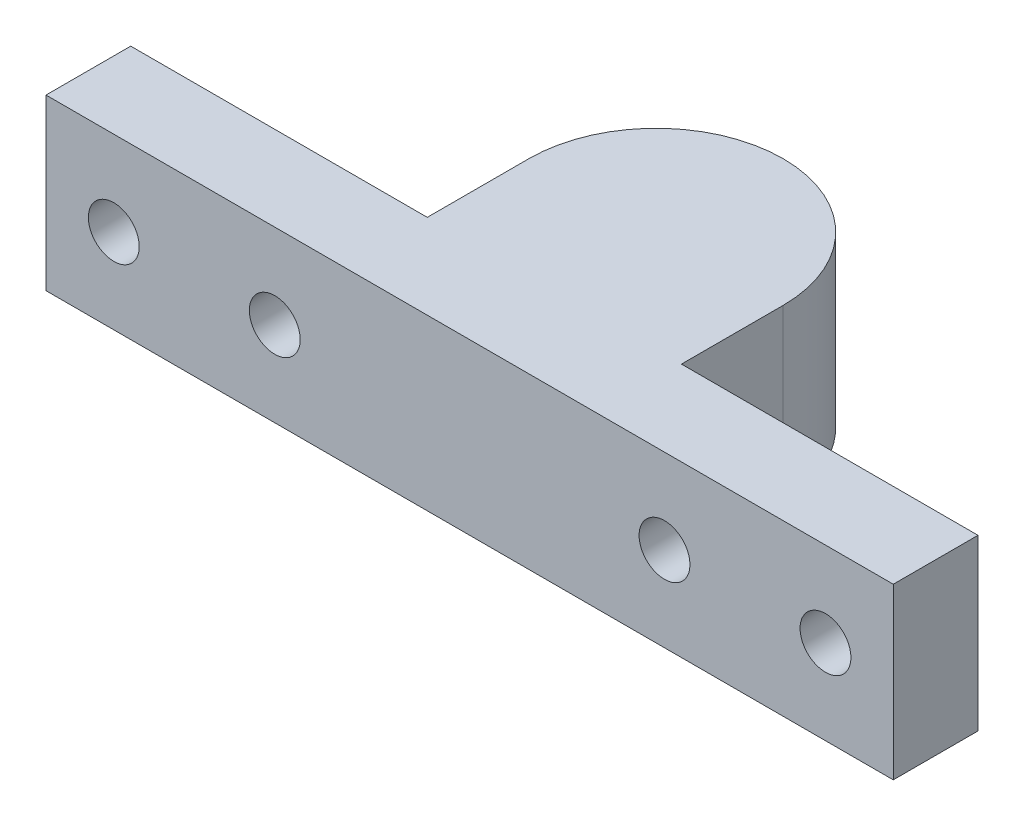
ISO-10303-21;
HEADER;
FILE_DESCRIPTION(('STEP AP214'),'2;1');
FILE_NAME('part.step','',(''),(''),'','','');
FILE_SCHEMA(('AUTOMOTIVE_DESIGN { 1 0 10303 214 1 1 1 1 }'));
ENDSEC;
DATA;
#1=APPLICATION_CONTEXT('core data for automotive mechanical design processes');
#2=APPLICATION_PROTOCOL_DEFINITION('international standard','automotive_design',2000,#1);
#3=PRODUCT_CONTEXT('',#1,'mechanical');
#4=PRODUCT('Part','Part','',(#3));
#5=PRODUCT_RELATED_PRODUCT_CATEGORY('part','',(#4));
#6=PRODUCT_DEFINITION_FORMATION('','',#4);
#7=PRODUCT_DEFINITION_CONTEXT('part definition',#1,'design');
#8=PRODUCT_DEFINITION('design','',#6,#7);
#9=PRODUCT_DEFINITION_SHAPE('','',#8);
#10=(LENGTH_UNIT() NAMED_UNIT(*) SI_UNIT(.MILLI.,.METRE.));
#11=(NAMED_UNIT(*) PLANE_ANGLE_UNIT() SI_UNIT($,.RADIAN.));
#12=(NAMED_UNIT(*) SI_UNIT($,.STERADIAN.) SOLID_ANGLE_UNIT());
#13=UNCERTAINTY_MEASURE_WITH_UNIT(LENGTH_MEASURE(1.E-05),#10,'distance_accuracy_value','');
#14=(GEOMETRIC_REPRESENTATION_CONTEXT(3) GLOBAL_UNCERTAINTY_ASSIGNED_CONTEXT((#13)) GLOBAL_UNIT_ASSIGNED_CONTEXT((#10,
#11,#12)) REPRESENTATION_CONTEXT('',''));
#15=CARTESIAN_POINT('',(0.,0.,0.));
#16=DIRECTION('',(0.,0.,1.));
#17=DIRECTION('',(1.,0.,0.));
#18=AXIS2_PLACEMENT_3D('',#15,#16,#17);
#19=CARTESIAN_POINT('',(-25.,10.,0.));
#20=DIRECTION('',(0.,0.,-1.));
#21=DIRECTION('',(-1.,0.,0.));
#22=AXIS2_PLACEMENT_3D('',#19,#20,#21);
#23=PLANE('',#22);
#24=CARTESIAN_POINT('',(21.,5.,0.));
#25=DIRECTION('',(0.,0.,-1.));
#26=DIRECTION('',(-1.,0.,0.));
#27=AXIS2_PLACEMENT_3D('',#24,#25,#26);
#28=CIRCLE('',#27,1.5);
#29=CARTESIAN_POINT('',(19.5,5.,0.));
#30=VERTEX_POINT('',#29);
#31=EDGE_CURVE('E167',#30,#30,#28,.T.);
#32=ORIENTED_EDGE('',*,*,#31,.T.);
#33=EDGE_LOOP('',(#32));
#34=FACE_BOUND('',#33,.T.);
#35=CARTESIAN_POINT('',(11.5,5.,0.));
#36=DIRECTION('',(0.,0.,-1.));
#37=DIRECTION('',(-1.,0.,0.));
#38=AXIS2_PLACEMENT_3D('',#35,#36,#37);
#39=CIRCLE('',#38,1.5);
#40=CARTESIAN_POINT('',(10.,5.,0.));
#41=VERTEX_POINT('',#40);
#42=EDGE_CURVE('E244',#41,#41,#39,.T.);
#43=ORIENTED_EDGE('',*,*,#42,.T.);
#44=EDGE_LOOP('',(#43));
#45=FACE_BOUND('',#44,.T.);
#46=CARTESIAN_POINT('',(-11.5,5.,0.));
#47=DIRECTION('',(0.,0.,-1.));
#48=DIRECTION('',(-1.,0.,0.));
#49=AXIS2_PLACEMENT_3D('',#46,#47,#48);
#50=CIRCLE('',#49,1.5);
#51=CARTESIAN_POINT('',(-13.,5.,0.));
#52=VERTEX_POINT('',#51);
#53=EDGE_CURVE('E236',#52,#52,#50,.T.);
#54=ORIENTED_EDGE('',*,*,#53,.T.);
#55=EDGE_LOOP('',(#54));
#56=FACE_BOUND('',#55,.T.);
#57=CARTESIAN_POINT('',(-21.,5.,0.));
#58=DIRECTION('',(0.,0.,-1.));
#59=DIRECTION('',(-1.,0.,0.));
#60=AXIS2_PLACEMENT_3D('',#57,#58,#59);
#61=CIRCLE('',#60,1.5);
#62=CARTESIAN_POINT('',(-22.5,5.,0.));
#63=VERTEX_POINT('',#62);
#64=EDGE_CURVE('E227',#63,#63,#61,.T.);
#65=ORIENTED_EDGE('',*,*,#64,.T.);
#66=EDGE_LOOP('',(#65));
#67=FACE_BOUND('',#66,.T.);
#68=DIRECTION('',(1.,0.,0.));
#69=VECTOR('',#68,1.);
#70=CARTESIAN_POINT('',(-25.,0.,0.));
#71=LINE('',#70,#69);
#72=CARTESIAN_POINT('',(-25.,0.,0.));
#73=VERTEX_POINT('',#72);
#74=CARTESIAN_POINT('',(25.,0.,0.));
#75=VERTEX_POINT('',#74);
#76=EDGE_CURVE('E163',#73,#75,#71,.T.);
#77=ORIENTED_EDGE('',*,*,#76,.T.);
#78=DIRECTION('',(0.,-1.,0.));
#79=VECTOR('',#78,1.);
#80=CARTESIAN_POINT('',(25.,10.,0.));
#81=LINE('',#80,#79);
#82=CARTESIAN_POINT('',(25.,10.,0.));
#83=VERTEX_POINT('',#82);
#84=EDGE_CURVE('E11',#83,#75,#81,.T.);
#85=ORIENTED_EDGE('',*,*,#84,.F.);
#86=DIRECTION('',(1.,0.,0.));
#87=VECTOR('',#86,1.);
#88=CARTESIAN_POINT('',(-25.,10.,0.));
#89=LINE('',#88,#87);
#90=CARTESIAN_POINT('',(-25.,10.,0.));
#91=VERTEX_POINT('',#90);
#92=EDGE_CURVE('E190',#91,#83,#89,.T.);
#93=ORIENTED_EDGE('',*,*,#92,.F.);
#94=DIRECTION('',(0.,-1.,0.));
#95=VECTOR('',#94,1.);
#96=CARTESIAN_POINT('',(-25.,10.,0.));
#97=LINE('',#96,#95);
#98=EDGE_CURVE('E70',#91,#73,#97,.T.);
#99=ORIENTED_EDGE('',*,*,#98,.T.);
#100=EDGE_LOOP('',(#77,#85,#93,#99));
#101=FACE_BOUND('',#100,.T.);
#102=ADVANCED_FACE('F46',(#34,#45,#56,#67,#101),#23,.F.);
#103=CARTESIAN_POINT('',(25.,10.,0.));
#104=DIRECTION('',(-1.,0.,0.));
#105=DIRECTION('',(0.,0.,1.));
#106=AXIS2_PLACEMENT_3D('',#103,#104,#105);
#107=PLANE('',#106);
#108=DIRECTION('',(0.,0.,-1.));
#109=VECTOR('',#108,1.);
#110=CARTESIAN_POINT('',(25.,0.,0.));
#111=LINE('',#110,#109);
#112=CARTESIAN_POINT('',(25.,0.,-5.00000000000001));
#113=VERTEX_POINT('',#112);
#114=EDGE_CURVE('E166',#75,#113,#111,.T.);
#115=ORIENTED_EDGE('',*,*,#114,.T.);
#116=DIRECTION('',(0.,-1.,0.));
#117=VECTOR('',#116,1.);
#118=CARTESIAN_POINT('',(25.,10.,-5.00000000000001));
#119=LINE('',#118,#117);
#120=CARTESIAN_POINT('',(25.,10.,-5.00000000000001));
#121=VERTEX_POINT('',#120);
#122=EDGE_CURVE('E54',#121,#113,#119,.T.);
#123=ORIENTED_EDGE('',*,*,#122,.F.);
#124=DIRECTION('',(0.,0.,-1.));
#125=VECTOR('',#124,1.);
#126=CARTESIAN_POINT('',(25.,10.,0.));
#127=LINE('',#126,#125);
#128=EDGE_CURVE('E109',#83,#121,#127,.T.);
#129=ORIENTED_EDGE('',*,*,#128,.F.);
#130=ORIENTED_EDGE('',*,*,#84,.T.);
#131=EDGE_LOOP('',(#115,#123,#129,#130));
#132=FACE_BOUND('',#131,.T.);
#133=ADVANCED_FACE('F341',(#132),#107,.F.);
#134=CARTESIAN_POINT('',(25.,10.,-5.00000000000001));
#135=DIRECTION('',(0.,0.,1.));
#136=DIRECTION('',(1.,0.,0.));
#137=AXIS2_PLACEMENT_3D('',#134,#135,#136);
#138=PLANE('',#137);
#139=CARTESIAN_POINT('',(21.,5.,-5.00000000000001));
#140=DIRECTION('',(0.,0.,-1.));
#141=DIRECTION('',(-1.,0.,0.));
#142=AXIS2_PLACEMENT_3D('',#139,#140,#141);
#143=CIRCLE('',#142,1.5);
#144=CARTESIAN_POINT('',(19.5,5.,-5.00000000000001));
#145=VERTEX_POINT('',#144);
#146=EDGE_CURVE('E252',#145,#145,#143,.T.);
#147=ORIENTED_EDGE('',*,*,#146,.F.);
#148=EDGE_LOOP('',(#147));
#149=FACE_BOUND('',#148,.T.);
#150=CARTESIAN_POINT('',(11.5,5.,-5.00000000000001));
#151=DIRECTION('',(0.,0.,-1.));
#152=DIRECTION('',(-1.,0.,0.));
#153=AXIS2_PLACEMENT_3D('',#150,#151,#152);
#154=CIRCLE('',#153,1.5);
#155=CARTESIAN_POINT('',(10.,5.,-5.00000000000001));
#156=VERTEX_POINT('',#155);
#157=EDGE_CURVE('E248',#156,#156,#154,.T.);
#158=ORIENTED_EDGE('',*,*,#157,.F.);
#159=EDGE_LOOP('',(#158));
#160=FACE_BOUND('',#159,.T.);
#161=DIRECTION('',(-1.,0.,0.));
#162=VECTOR('',#161,1.);
#163=CARTESIAN_POINT('',(25.,0.,-5.00000000000001));
#164=LINE('',#163,#162);
#165=CARTESIAN_POINT('',(7.5,0.,-5.00000000000001));
#166=VERTEX_POINT('',#165);
#167=EDGE_CURVE('E170',#113,#166,#164,.T.);
#168=ORIENTED_EDGE('',*,*,#167,.T.);
#169=DIRECTION('',(0.,-1.,0.));
#170=VECTOR('',#169,1.);
#171=CARTESIAN_POINT('',(7.5,10.,-5.00000000000001));
#172=LINE('',#171,#170);
#173=CARTESIAN_POINT('',(7.5,10.,-5.00000000000001));
#174=VERTEX_POINT('',#173);
#175=EDGE_CURVE('E200',#174,#166,#172,.T.);
#176=ORIENTED_EDGE('',*,*,#175,.F.);
#177=DIRECTION('',(-1.,0.,0.));
#178=VECTOR('',#177,1.);
#179=CARTESIAN_POINT('',(25.,10.,-5.00000000000001));
#180=LINE('',#179,#178);
#181=EDGE_CURVE('E210',#121,#174,#180,.T.);
#182=ORIENTED_EDGE('',*,*,#181,.F.);
#183=ORIENTED_EDGE('',*,*,#122,.T.);
#184=EDGE_LOOP('',(#168,#176,#182,#183));
#185=FACE_BOUND('',#184,.T.);
#186=ADVANCED_FACE('F208',(#149,#160,#185),#138,.F.);
#187=CARTESIAN_POINT('',(7.5,10.,-5.00000000000001));
#188=DIRECTION('',(-1.,0.,0.));
#189=DIRECTION('',(0.,0.,1.));
#190=AXIS2_PLACEMENT_3D('',#187,#188,#189);
#191=PLANE('',#190);
#192=DIRECTION('',(0.,0.,-1.));
#193=VECTOR('',#192,1.);
#194=CARTESIAN_POINT('',(7.5,0.,-5.00000000000001));
#195=LINE('',#194,#193);
#196=CARTESIAN_POINT('',(7.5,0.,-11.));
#197=VERTEX_POINT('',#196);
#198=EDGE_CURVE('E173',#166,#197,#195,.T.);
#199=ORIENTED_EDGE('',*,*,#198,.T.);
#200=DIRECTION('',(0.,-1.,0.));
#201=VECTOR('',#200,1.);
#202=CARTESIAN_POINT('',(7.5,10.,-11.));
#203=LINE('',#202,#201);
#204=CARTESIAN_POINT('',(7.5,10.,-11.));
#205=VERTEX_POINT('',#204);
#206=EDGE_CURVE('E197',#205,#197,#203,.T.);
#207=ORIENTED_EDGE('',*,*,#206,.F.);
#208=DIRECTION('',(0.,0.,-1.));
#209=VECTOR('',#208,1.);
#210=CARTESIAN_POINT('',(7.5,10.,-5.00000000000001));
#211=LINE('',#210,#209);
#212=EDGE_CURVE('E157',#174,#205,#211,.T.);
#213=ORIENTED_EDGE('',*,*,#212,.F.);
#214=ORIENTED_EDGE('',*,*,#175,.T.);
#215=EDGE_LOOP('',(#199,#207,#213,#214));
#216=FACE_BOUND('',#215,.T.);
#217=ADVANCED_FACE('F217',(#216),#191,.F.);
#218=CARTESIAN_POINT('',(0.,10.,-11.));
#219=DIRECTION('',(0.,-1.,0.));
#220=DIRECTION('',(0.,0.,-1.));
#221=AXIS2_PLACEMENT_3D('',#218,#219,#220);
#222=CYLINDRICAL_SURFACE('',#221,7.5);
#223=CARTESIAN_POINT('',(0.,0.,-11.));
#224=DIRECTION('',(0.,-1.,0.));
#225=DIRECTION('',(0.,0.,-1.));
#226=AXIS2_PLACEMENT_3D('',#223,#224,#225);
#227=CIRCLE('',#226,7.5);
#228=CARTESIAN_POINT('',(-7.5,0.,-11.));
#229=VERTEX_POINT('',#228);
#230=EDGE_CURVE('E177',#229,#197,#227,.T.);
#231=ORIENTED_EDGE('',*,*,#230,.F.);
#232=DIRECTION('',(0.,-1.,0.));
#233=VECTOR('',#232,1.);
#234=CARTESIAN_POINT('',(-7.5,10.,-11.));
#235=LINE('',#234,#233);
#236=CARTESIAN_POINT('',(-7.5,10.,-11.));
#237=VERTEX_POINT('',#236);
#238=EDGE_CURVE('E139',#237,#229,#235,.T.);
#239=ORIENTED_EDGE('',*,*,#238,.F.);
#240=CARTESIAN_POINT('',(0.,10.,-11.));
#241=DIRECTION('',(0.,-1.,0.));
#242=DIRECTION('',(0.,0.,-1.));
#243=AXIS2_PLACEMENT_3D('',#240,#241,#242);
#244=CIRCLE('',#243,7.5);
#245=EDGE_CURVE('E153',#237,#205,#244,.T.);
#246=ORIENTED_EDGE('',*,*,#245,.T.);
#247=ORIENTED_EDGE('',*,*,#206,.T.);
#248=EDGE_LOOP('',(#231,#239,#246,#247));
#249=FACE_BOUND('',#248,.T.);
#250=ADVANCED_FACE('F369',(#249),#222,.T.);
#251=CARTESIAN_POINT('',(-7.5,10.,-5.));
#252=DIRECTION('',(-1.,0.,0.));
#253=DIRECTION('',(0.,0.,1.));
#254=AXIS2_PLACEMENT_3D('',#251,#252,#253);
#255=PLANE('',#254);
#256=DIRECTION('',(0.,0.,-1.));
#257=VECTOR('',#256,1.);
#258=CARTESIAN_POINT('',(-7.5,0.,-5.));
#259=LINE('',#258,#257);
#260=CARTESIAN_POINT('',(-7.5,0.,-5.));
#261=VERTEX_POINT('',#260);
#262=EDGE_CURVE('E134',#261,#229,#259,.T.);
#263=ORIENTED_EDGE('',*,*,#262,.F.);
#264=DIRECTION('',(0.,-1.,0.));
#265=VECTOR('',#264,1.);
#266=CARTESIAN_POINT('',(-7.5,10.,-5.));
#267=LINE('',#266,#265);
#268=CARTESIAN_POINT('',(-7.5,10.,-5.));
#269=VERTEX_POINT('',#268);
#270=EDGE_CURVE('E128',#269,#261,#267,.T.);
#271=ORIENTED_EDGE('',*,*,#270,.F.);
#272=DIRECTION('',(0.,0.,-1.));
#273=VECTOR('',#272,1.);
#274=CARTESIAN_POINT('',(-7.5,10.,-5.));
#275=LINE('',#274,#273);
#276=EDGE_CURVE('E132',#269,#237,#275,.T.);
#277=ORIENTED_EDGE('',*,*,#276,.T.);
#278=ORIENTED_EDGE('',*,*,#238,.T.);
#279=EDGE_LOOP('',(#263,#271,#277,#278));
#280=FACE_BOUND('',#279,.T.);
#281=ADVANCED_FACE('F130',(#280),#255,.T.);
#282=CARTESIAN_POINT('',(-7.5,10.,-5.));
#283=DIRECTION('',(0.,0.,1.));
#284=DIRECTION('',(1.,0.,0.));
#285=AXIS2_PLACEMENT_3D('',#282,#283,#284);
#286=PLANE('',#285);
#287=CARTESIAN_POINT('',(-11.5,5.,-5.));
#288=DIRECTION('',(0.,0.,-1.));
#289=DIRECTION('',(-1.,0.,0.));
#290=AXIS2_PLACEMENT_3D('',#287,#288,#289);
#291=CIRCLE('',#290,1.5);
#292=CARTESIAN_POINT('',(-13.,5.,-5.));
#293=VERTEX_POINT('',#292);
#294=EDGE_CURVE('E240',#293,#293,#291,.T.);
#295=ORIENTED_EDGE('',*,*,#294,.F.);
#296=EDGE_LOOP('',(#295));
#297=FACE_BOUND('',#296,.T.);
#298=CARTESIAN_POINT('',(-21.,5.,-5.));
#299=DIRECTION('',(0.,0.,-1.));
#300=DIRECTION('',(-1.,0.,0.));
#301=AXIS2_PLACEMENT_3D('',#298,#299,#300);
#302=CIRCLE('',#301,1.5);
#303=CARTESIAN_POINT('',(-22.5,5.,-5.));
#304=VERTEX_POINT('',#303);
#305=EDGE_CURVE('E231',#304,#304,#302,.T.);
#306=ORIENTED_EDGE('',*,*,#305,.F.);
#307=EDGE_LOOP('',(#306));
#308=FACE_BOUND('',#307,.T.);
#309=DIRECTION('',(-1.,0.,0.));
#310=VECTOR('',#309,1.);
#311=CARTESIAN_POINT('',(-7.5,0.,-5.));
#312=LINE('',#311,#310);
#313=CARTESIAN_POINT('',(-25.,0.,-5.));
#314=VERTEX_POINT('',#313);
#315=EDGE_CURVE('E183',#261,#314,#312,.T.);
#316=ORIENTED_EDGE('',*,*,#315,.T.);
#317=DIRECTION('',(0.,-1.,0.));
#318=VECTOR('',#317,1.);
#319=CARTESIAN_POINT('',(-25.,10.,-5.));
#320=LINE('',#319,#318);
#321=CARTESIAN_POINT('',(-25.,10.,-5.));
#322=VERTEX_POINT('',#321);
#323=EDGE_CURVE('E140',#322,#314,#320,.T.);
#324=ORIENTED_EDGE('',*,*,#323,.F.);
#325=DIRECTION('',(-1.,0.,0.));
#326=VECTOR('',#325,1.);
#327=CARTESIAN_POINT('',(-7.5,10.,-5.));
#328=LINE('',#327,#326);
#329=EDGE_CURVE('E143',#269,#322,#328,.T.);
#330=ORIENTED_EDGE('',*,*,#329,.F.);
#331=ORIENTED_EDGE('',*,*,#270,.T.);
#332=EDGE_LOOP('',(#316,#324,#330,#331));
#333=FACE_BOUND('',#332,.T.);
#334=ADVANCED_FACE('F144',(#297,#308,#333),#286,.F.);
#335=CARTESIAN_POINT('',(-25.,10.,0.));
#336=DIRECTION('',(-1.,0.,0.));
#337=DIRECTION('',(0.,0.,1.));
#338=AXIS2_PLACEMENT_3D('',#335,#336,#337);
#339=PLANE('',#338);
#340=DIRECTION('',(0.,0.,-1.));
#341=VECTOR('',#340,1.);
#342=CARTESIAN_POINT('',(-25.,0.,0.));
#343=LINE('',#342,#341);
#344=EDGE_CURVE('E186',#73,#314,#343,.T.);
#345=ORIENTED_EDGE('',*,*,#344,.F.);
#346=ORIENTED_EDGE('',*,*,#98,.F.);
#347=DIRECTION('',(0.,0.,-1.));
#348=VECTOR('',#347,1.);
#349=CARTESIAN_POINT('',(-25.,10.,0.));
#350=LINE('',#349,#348);
#351=EDGE_CURVE('E148',#91,#322,#350,.T.);
#352=ORIENTED_EDGE('',*,*,#351,.T.);
#353=ORIENTED_EDGE('',*,*,#323,.T.);
#354=EDGE_LOOP('',(#345,#346,#352,#353));
#355=FACE_BOUND('',#354,.T.);
#356=ADVANCED_FACE('F356',(#355),#339,.T.);
#357=CARTESIAN_POINT('',(0.,10.,-11.));
#358=DIRECTION('',(0.,-1.,0.));
#359=DIRECTION('',(0.,0.,-1.));
#360=AXIS2_PLACEMENT_3D('',#357,#358,#359);
#361=PLANE('',#360);
#362=ORIENTED_EDGE('',*,*,#92,.T.);
#363=ORIENTED_EDGE('',*,*,#128,.T.);
#364=ORIENTED_EDGE('',*,*,#181,.T.);
#365=ORIENTED_EDGE('',*,*,#212,.T.);
#366=ORIENTED_EDGE('',*,*,#245,.F.);
#367=ORIENTED_EDGE('',*,*,#276,.F.);
#368=ORIENTED_EDGE('',*,*,#329,.T.);
#369=ORIENTED_EDGE('',*,*,#351,.F.);
#370=EDGE_LOOP('',(#362,#363,#364,#365,#366,#367,#368,#369));
#371=FACE_BOUND('',#370,.T.);
#372=ADVANCED_FACE('F151',(#371),#361,.F.);
#373=CARTESIAN_POINT('',(0.,0.,-11.));
#374=DIRECTION('',(0.,-1.,0.));
#375=DIRECTION('',(0.,0.,-1.));
#376=AXIS2_PLACEMENT_3D('',#373,#374,#375);
#377=PLANE('',#376);
#378=DIRECTION('',(0.,0.,1.));
#379=VECTOR('',#378,1.);
#380=CARTESIAN_POINT('',(3.99761994618308,0.,-14.9976199461831));
#381=LINE('',#380,#379);
#382=CARTESIAN_POINT('',(3.99761994618308,0.,-14.9976199461831));
#383=VERTEX_POINT('',#382);
#384=CARTESIAN_POINT('',(3.99761994618308,0.,-7.00238005381693));
#385=VERTEX_POINT('',#384);
#386=EDGE_CURVE('E61',#383,#385,#381,.T.);
#387=ORIENTED_EDGE('',*,*,#386,.F.);
#388=DIRECTION('',(1.,0.,0.));
#389=VECTOR('',#388,1.);
#390=CARTESIAN_POINT('',(-3.99761994618308,0.,-14.9976199461831));
#391=LINE('',#390,#389);
#392=CARTESIAN_POINT('',(-3.99761994618308,0.,-14.9976199461831));
#393=VERTEX_POINT('',#392);
#394=EDGE_CURVE('E273',#393,#383,#391,.T.);
#395=ORIENTED_EDGE('',*,*,#394,.F.);
#396=DIRECTION('',(0.,0.,-1.));
#397=VECTOR('',#396,1.);
#398=CARTESIAN_POINT('',(-3.99761994618308,0.,-14.9976199461831));
#399=LINE('',#398,#397);
#400=CARTESIAN_POINT('',(-3.99761994618308,0.,-7.00238005381693));
#401=VERTEX_POINT('',#400);
#402=EDGE_CURVE('E278',#401,#393,#399,.T.);
#403=ORIENTED_EDGE('',*,*,#402,.F.);
#404=DIRECTION('',(-1.,0.,0.));
#405=VECTOR('',#404,1.);
#406=CARTESIAN_POINT('',(-3.99761994618308,0.,-7.00238005381693));
#407=LINE('',#406,#405);
#408=EDGE_CURVE('E282',#385,#401,#407,.T.);
#409=ORIENTED_EDGE('',*,*,#408,.F.);
#410=EDGE_LOOP('',(#387,#395,#403,#409));
#411=FACE_BOUND('',#410,.T.);
#412=ORIENTED_EDGE('',*,*,#76,.F.);
#413=ORIENTED_EDGE('',*,*,#344,.T.);
#414=ORIENTED_EDGE('',*,*,#315,.F.);
#415=ORIENTED_EDGE('',*,*,#262,.T.);
#416=ORIENTED_EDGE('',*,*,#230,.T.);
#417=ORIENTED_EDGE('',*,*,#198,.F.);
#418=ORIENTED_EDGE('',*,*,#167,.F.);
#419=ORIENTED_EDGE('',*,*,#114,.F.);
#420=EDGE_LOOP('',(#412,#413,#414,#415,#416,#417,#418,#419));
#421=FACE_BOUND('',#420,.T.);
#422=ADVANCED_FACE('F213',(#411,#421),#377,.T.);
#423=CARTESIAN_POINT('',(-21.,5.,0.));
#424=DIRECTION('',(0.,0.,-1.));
#425=DIRECTION('',(-1.,0.,0.));
#426=AXIS2_PLACEMENT_3D('',#423,#424,#425);
#427=CYLINDRICAL_SURFACE('',#426,1.5);
#428=ORIENTED_EDGE('',*,*,#64,.F.);
#429=EDGE_LOOP('',(#428));
#430=FACE_BOUND('',#429,.T.);
#431=ORIENTED_EDGE('',*,*,#305,.T.);
#432=EDGE_LOOP('',(#431));
#433=FACE_BOUND('',#432,.T.);
#434=ADVANCED_FACE('F394',(#430,#433),#427,.F.);
#435=CARTESIAN_POINT('',(-11.5,5.,0.));
#436=DIRECTION('',(0.,0.,-1.));
#437=DIRECTION('',(-1.,0.,0.));
#438=AXIS2_PLACEMENT_3D('',#435,#436,#437);
#439=CYLINDRICAL_SURFACE('',#438,1.5);
#440=ORIENTED_EDGE('',*,*,#53,.F.);
#441=EDGE_LOOP('',(#440));
#442=FACE_BOUND('',#441,.T.);
#443=ORIENTED_EDGE('',*,*,#294,.T.);
#444=EDGE_LOOP('',(#443));
#445=FACE_BOUND('',#444,.T.);
#446=ADVANCED_FACE('F385',(#442,#445),#439,.F.);
#447=CARTESIAN_POINT('',(11.5,5.,0.));
#448=DIRECTION('',(0.,0.,-1.));
#449=DIRECTION('',(-1.,0.,0.));
#450=AXIS2_PLACEMENT_3D('',#447,#448,#449);
#451=CYLINDRICAL_SURFACE('',#450,1.5);
#452=ORIENTED_EDGE('',*,*,#42,.F.);
#453=EDGE_LOOP('',(#452));
#454=FACE_BOUND('',#453,.T.);
#455=ORIENTED_EDGE('',*,*,#157,.T.);
#456=EDGE_LOOP('',(#455));
#457=FACE_BOUND('',#456,.T.);
#458=ADVANCED_FACE('F382',(#454,#457),#451,.F.);
#459=CARTESIAN_POINT('',(21.,5.,0.));
#460=DIRECTION('',(0.,0.,-1.));
#461=DIRECTION('',(-1.,0.,0.));
#462=AXIS2_PLACEMENT_3D('',#459,#460,#461);
#463=CYLINDRICAL_SURFACE('',#462,1.5);
#464=ORIENTED_EDGE('',*,*,#31,.F.);
#465=EDGE_LOOP('',(#464));
#466=FACE_BOUND('',#465,.T.);
#467=ORIENTED_EDGE('',*,*,#146,.T.);
#468=EDGE_LOOP('',(#467));
#469=FACE_BOUND('',#468,.T.);
#470=ADVANCED_FACE('F384',(#466,#469),#463,.F.);
#471=CARTESIAN_POINT('',(3.99761994618308,6.5,-14.9976199461831));
#472=DIRECTION('',(1.,0.,0.));
#473=DIRECTION('',(0.,0.,-1.));
#474=AXIS2_PLACEMENT_3D('',#471,#472,#473);
#475=PLANE('',#474);
#476=ORIENTED_EDGE('',*,*,#386,.T.);
#477=DIRECTION('',(0.,-1.,0.));
#478=VECTOR('',#477,1.);
#479=CARTESIAN_POINT('',(3.99761994618308,6.5,-7.00238005381693));
#480=LINE('',#479,#478);
#481=CARTESIAN_POINT('',(3.99761994618308,6.5,-7.00238005381693));
#482=VERTEX_POINT('',#481);
#483=EDGE_CURVE('E259',#482,#385,#480,.T.);
#484=ORIENTED_EDGE('',*,*,#483,.F.);
#485=DIRECTION('',(0.,0.,1.));
#486=VECTOR('',#485,1.);
#487=CARTESIAN_POINT('',(3.99761994618308,6.5,-14.9976199461831));
#488=LINE('',#487,#486);
#489=CARTESIAN_POINT('',(3.99761994618308,6.5,-14.9976199461831));
#490=VERTEX_POINT('',#489);
#491=EDGE_CURVE('E277',#490,#482,#488,.T.);
#492=ORIENTED_EDGE('',*,*,#491,.F.);
#493=DIRECTION('',(0.,-1.,0.));
#494=VECTOR('',#493,1.);
#495=CARTESIAN_POINT('',(3.99761994618308,6.5,-14.9976199461831));
#496=LINE('',#495,#494);
#497=EDGE_CURVE('E232',#490,#383,#496,.T.);
#498=ORIENTED_EDGE('',*,*,#497,.T.);
#499=EDGE_LOOP('',(#476,#484,#492,#498));
#500=FACE_BOUND('',#499,.T.);
#501=ADVANCED_FACE('F309',(#500),#475,.F.);
#502=CARTESIAN_POINT('',(-3.99761994618308,6.5,-14.9976199461831));
#503=DIRECTION('',(0.,0.,-1.));
#504=DIRECTION('',(-1.,0.,0.));
#505=AXIS2_PLACEMENT_3D('',#502,#503,#504);
#506=PLANE('',#505);
#507=ORIENTED_EDGE('',*,*,#394,.T.);
#508=ORIENTED_EDGE('',*,*,#497,.F.);
#509=DIRECTION('',(1.,0.,0.));
#510=VECTOR('',#509,1.);
#511=CARTESIAN_POINT('',(-3.99761994618308,6.5,-14.9976199461831));
#512=LINE('',#511,#510);
#513=CARTESIAN_POINT('',(-3.99761994618308,6.5,-14.9976199461831));
#514=VERTEX_POINT('',#513);
#515=EDGE_CURVE('E263',#514,#490,#512,.T.);
#516=ORIENTED_EDGE('',*,*,#515,.F.);
#517=DIRECTION('',(0.,-1.,0.));
#518=VECTOR('',#517,1.);
#519=CARTESIAN_POINT('',(-3.99761994618308,6.5,-14.9976199461831));
#520=LINE('',#519,#518);
#521=EDGE_CURVE('E267',#514,#393,#520,.T.);
#522=ORIENTED_EDGE('',*,*,#521,.T.);
#523=EDGE_LOOP('',(#507,#508,#516,#522));
#524=FACE_BOUND('',#523,.T.);
#525=ADVANCED_FACE('F320',(#524),#506,.F.);
#526=CARTESIAN_POINT('',(-3.99761994618308,6.5,-14.9976199461831));
#527=DIRECTION('',(-1.,0.,0.));
#528=DIRECTION('',(0.,0.,1.));
#529=AXIS2_PLACEMENT_3D('',#526,#527,#528);
#530=PLANE('',#529);
#531=ORIENTED_EDGE('',*,*,#402,.T.);
#532=ORIENTED_EDGE('',*,*,#521,.F.);
#533=DIRECTION('',(0.,0.,-1.));
#534=VECTOR('',#533,1.);
#535=CARTESIAN_POINT('',(-3.99761994618308,6.5,-14.9976199461831));
#536=LINE('',#535,#534);
#537=CARTESIAN_POINT('',(-3.99761994618308,6.5,-7.00238005381693));
#538=VERTEX_POINT('',#537);
#539=EDGE_CURVE('E291',#538,#514,#536,.T.);
#540=ORIENTED_EDGE('',*,*,#539,.F.);
#541=DIRECTION('',(0.,-1.,0.));
#542=VECTOR('',#541,1.);
#543=CARTESIAN_POINT('',(-3.99761994618308,6.5,-7.00238005381693));
#544=LINE('',#543,#542);
#545=EDGE_CURVE('E262',#538,#401,#544,.T.);
#546=ORIENTED_EDGE('',*,*,#545,.T.);
#547=EDGE_LOOP('',(#531,#532,#540,#546));
#548=FACE_BOUND('',#547,.T.);
#549=ADVANCED_FACE('F325',(#548),#530,.F.);
#550=CARTESIAN_POINT('',(-3.99761994618308,6.5,-7.00238005381693));
#551=DIRECTION('',(0.,0.,1.));
#552=DIRECTION('',(1.,0.,0.));
#553=AXIS2_PLACEMENT_3D('',#550,#551,#552);
#554=PLANE('',#553);
#555=ORIENTED_EDGE('',*,*,#408,.T.);
#556=ORIENTED_EDGE('',*,*,#545,.F.);
#557=DIRECTION('',(-1.,0.,0.));
#558=VECTOR('',#557,1.);
#559=CARTESIAN_POINT('',(-3.99761994618308,6.5,-7.00238005381693));
#560=LINE('',#559,#558);
#561=EDGE_CURVE('E295',#482,#538,#560,.T.);
#562=ORIENTED_EDGE('',*,*,#561,.F.);
#563=ORIENTED_EDGE('',*,*,#483,.T.);
#564=EDGE_LOOP('',(#555,#556,#562,#563));
#565=FACE_BOUND('',#564,.T.);
#566=ADVANCED_FACE('F330',(#565),#554,.F.);
#567=CARTESIAN_POINT('',(0.,6.5,0.));
#568=DIRECTION('',(0.,1.,0.));
#569=DIRECTION('',(0.,0.,1.));
#570=AXIS2_PLACEMENT_3D('',#567,#568,#569);
#571=PLANE('',#570);
#572=ORIENTED_EDGE('',*,*,#491,.T.);
#573=ORIENTED_EDGE('',*,*,#561,.T.);
#574=ORIENTED_EDGE('',*,*,#539,.T.);
#575=ORIENTED_EDGE('',*,*,#515,.T.);
#576=EDGE_LOOP('',(#572,#573,#574,#575));
#577=FACE_BOUND('',#576,.T.);
#578=ADVANCED_FACE('F304',(#577),#571,.F.);
#579=CLOSED_SHELL('',(#102,#133,#186,#217,#250,#281,#334,#356,#372,#422,#434,#446,#458,#470,
#501,#525,#549,#566,#578));
#580=MANIFOLD_SOLID_BREP('B2',#579);
#581=ADVANCED_BREP_SHAPE_REPRESENTATION('',(#18,#580),#14);
#582=SHAPE_DEFINITION_REPRESENTATION(#9,#581);
ENDSEC;
END-ISO-10303-21;
